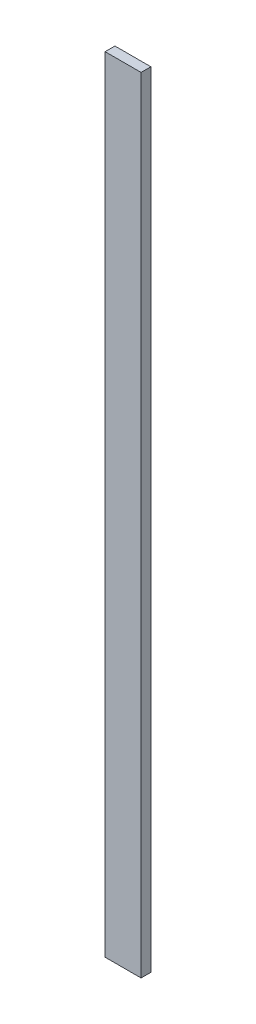
ISO-10303-21;
HEADER;
FILE_DESCRIPTION(('STEP AP214'),'2;1');
FILE_NAME('part.step','',(''),(''),'','','');
FILE_SCHEMA(('AUTOMOTIVE_DESIGN { 1 0 10303 214 1 1 1 1 }'));
ENDSEC;
DATA;
#1=APPLICATION_CONTEXT('core data for automotive mechanical design processes');
#2=APPLICATION_PROTOCOL_DEFINITION('international standard','automotive_design',2000,#1);
#3=PRODUCT_CONTEXT('',#1,'mechanical');
#4=PRODUCT('Part','Part','',(#3));
#5=PRODUCT_RELATED_PRODUCT_CATEGORY('part','',(#4));
#6=PRODUCT_DEFINITION_FORMATION('','',#4);
#7=PRODUCT_DEFINITION_CONTEXT('part definition',#1,'design');
#8=PRODUCT_DEFINITION('design','',#6,#7);
#9=PRODUCT_DEFINITION_SHAPE('','',#8);
#10=(LENGTH_UNIT() NAMED_UNIT(*) SI_UNIT(.MILLI.,.METRE.));
#11=(NAMED_UNIT(*) PLANE_ANGLE_UNIT() SI_UNIT($,.RADIAN.));
#12=(NAMED_UNIT(*) SI_UNIT($,.STERADIAN.) SOLID_ANGLE_UNIT());
#13=UNCERTAINTY_MEASURE_WITH_UNIT(LENGTH_MEASURE(1.E-05),#10,'distance_accuracy_value','');
#14=(GEOMETRIC_REPRESENTATION_CONTEXT(3) GLOBAL_UNCERTAINTY_ASSIGNED_CONTEXT((#13)) GLOBAL_UNIT_ASSIGNED_CONTEXT((#10,
#11,#12)) REPRESENTATION_CONTEXT('',''));
#15=CARTESIAN_POINT('',(0.,0.,0.));
#16=DIRECTION('',(0.,0.,1.));
#17=DIRECTION('',(1.,0.,0.));
#18=AXIS2_PLACEMENT_3D('',#15,#16,#17);
#19=CARTESIAN_POINT('',(-15.7044897978243,-51.4848222237951,38.1));
#20=DIRECTION('',(1.,0.,0.));
#21=DIRECTION('',(0.,0.,-1.));
#22=AXIS2_PLACEMENT_3D('',#19,#20,#21);
#23=PLANE('',#22);
#24=DIRECTION('',(0.,-1.,0.));
#25=VECTOR('',#24,1.);
#26=CARTESIAN_POINT('',(-15.7044897978243,-51.4848222237951,0.));
#27=LINE('',#26,#25);
#28=CARTESIAN_POINT('',(-15.7044897978243,2996.51517777621,0.));
#29=VERTEX_POINT('',#28);
#30=CARTESIAN_POINT('',(-15.7044897978243,-51.4848222237951,0.));
#31=VERTEX_POINT('',#30);
#32=EDGE_CURVE('E96',#29,#31,#27,.T.);
#33=ORIENTED_EDGE('',*,*,#32,.T.);
#34=DIRECTION('',(0.,0.,-1.));
#35=VECTOR('',#34,1.);
#36=CARTESIAN_POINT('',(-15.7044897978243,-51.4848222237951,38.1));
#37=LINE('',#36,#35);
#38=CARTESIAN_POINT('',(-15.7044897978243,-51.4848222237951,38.1));
#39=VERTEX_POINT('',#38);
#40=EDGE_CURVE('E11',#39,#31,#37,.T.);
#41=ORIENTED_EDGE('',*,*,#40,.F.);
#42=DIRECTION('',(0.,-1.,0.));
#43=VECTOR('',#42,1.);
#44=CARTESIAN_POINT('',(-15.7044897978243,-51.4848222237951,38.1));
#45=LINE('',#44,#43);
#46=CARTESIAN_POINT('',(-15.7044897978243,2996.51517777621,38.1));
#47=VERTEX_POINT('',#46);
#48=EDGE_CURVE('E84',#47,#39,#45,.T.);
#49=ORIENTED_EDGE('',*,*,#48,.F.);
#50=DIRECTION('',(0.,0.,-1.));
#51=VECTOR('',#50,1.);
#52=CARTESIAN_POINT('',(-15.7044897978243,2996.51517777621,38.1));
#53=LINE('',#52,#51);
#54=EDGE_CURVE('E92',#47,#29,#53,.T.);
#55=ORIENTED_EDGE('',*,*,#54,.T.);
#56=EDGE_LOOP('',(#33,#41,#49,#55));
#57=FACE_BOUND('',#56,.T.);
#58=ADVANCED_FACE('F33',(#57),#23,.F.);
#59=CARTESIAN_POINT('',(-15.7044897978243,-51.4848222237951,38.1));
#60=DIRECTION('',(0.,1.,0.));
#61=DIRECTION('',(0.,0.,1.));
#62=AXIS2_PLACEMENT_3D('',#59,#60,#61);
#63=PLANE('',#62);
#64=DIRECTION('',(1.,0.,0.));
#65=VECTOR('',#64,1.);
#66=CARTESIAN_POINT('',(-15.7044897978243,-51.4848222237951,0.));
#67=LINE('',#66,#65);
#68=CARTESIAN_POINT('',(123.995510202176,-51.4848222237951,0.));
#69=VERTEX_POINT('',#68);
#70=EDGE_CURVE('E88',#31,#69,#67,.T.);
#71=ORIENTED_EDGE('',*,*,#70,.T.);
#72=DIRECTION('',(0.,0.,-1.));
#73=VECTOR('',#72,1.);
#74=CARTESIAN_POINT('',(123.995510202176,-51.4848222237951,38.1));
#75=LINE('',#74,#73);
#76=CARTESIAN_POINT('',(123.995510202176,-51.4848222237951,38.1));
#77=VERTEX_POINT('',#76);
#78=EDGE_CURVE('E41',#77,#69,#75,.T.);
#79=ORIENTED_EDGE('',*,*,#78,.F.);
#80=DIRECTION('',(1.,0.,0.));
#81=VECTOR('',#80,1.);
#82=CARTESIAN_POINT('',(-15.7044897978243,-51.4848222237951,38.1));
#83=LINE('',#82,#81);
#84=EDGE_CURVE('E79',#39,#77,#83,.T.);
#85=ORIENTED_EDGE('',*,*,#84,.F.);
#86=ORIENTED_EDGE('',*,*,#40,.T.);
#87=EDGE_LOOP('',(#71,#79,#85,#86));
#88=FACE_BOUND('',#87,.T.);
#89=ADVANCED_FACE('F87',(#88),#63,.F.);
#90=CARTESIAN_POINT('',(123.995510202176,-51.4848222237951,38.1));
#91=DIRECTION('',(-1.,0.,0.));
#92=DIRECTION('',(0.,0.,1.));
#93=AXIS2_PLACEMENT_3D('',#90,#91,#92);
#94=PLANE('',#93);
#95=DIRECTION('',(0.,1.,0.));
#96=VECTOR('',#95,1.);
#97=CARTESIAN_POINT('',(123.995510202176,-51.4848222237951,0.));
#98=LINE('',#97,#96);
#99=CARTESIAN_POINT('',(123.995510202176,2996.51517777621,0.));
#100=VERTEX_POINT('',#99);
#101=EDGE_CURVE('E66',#69,#100,#98,.T.);
#102=ORIENTED_EDGE('',*,*,#101,.T.);
#103=DIRECTION('',(0.,0.,-1.));
#104=VECTOR('',#103,1.);
#105=CARTESIAN_POINT('',(123.995510202176,2996.51517777621,38.1));
#106=LINE('',#105,#104);
#107=CARTESIAN_POINT('',(123.995510202176,2996.51517777621,38.1));
#108=VERTEX_POINT('',#107);
#109=EDGE_CURVE('E89',#108,#100,#106,.T.);
#110=ORIENTED_EDGE('',*,*,#109,.F.);
#111=DIRECTION('',(0.,1.,0.));
#112=VECTOR('',#111,1.);
#113=CARTESIAN_POINT('',(123.995510202176,-51.4848222237951,38.1));
#114=LINE('',#113,#112);
#115=EDGE_CURVE('E82',#77,#108,#114,.T.);
#116=ORIENTED_EDGE('',*,*,#115,.F.);
#117=ORIENTED_EDGE('',*,*,#78,.T.);
#118=EDGE_LOOP('',(#102,#110,#116,#117));
#119=FACE_BOUND('',#118,.T.);
#120=ADVANCED_FACE('F90',(#119),#94,.F.);
#121=CARTESIAN_POINT('',(-15.7044897978243,2996.51517777621,38.1));
#122=DIRECTION('',(0.,-1.,0.));
#123=DIRECTION('',(0.,0.,-1.));
#124=AXIS2_PLACEMENT_3D('',#121,#122,#123);
#125=PLANE('',#124);
#126=DIRECTION('',(-1.,0.,0.));
#127=VECTOR('',#126,1.);
#128=CARTESIAN_POINT('',(-15.7044897978243,2996.51517777621,0.));
#129=LINE('',#128,#127);
#130=EDGE_CURVE('E72',#100,#29,#129,.T.);
#131=ORIENTED_EDGE('',*,*,#130,.T.);
#132=ORIENTED_EDGE('',*,*,#54,.F.);
#133=DIRECTION('',(-1.,0.,0.));
#134=VECTOR('',#133,1.);
#135=CARTESIAN_POINT('',(-15.7044897978243,2996.51517777621,38.1));
#136=LINE('',#135,#134);
#137=EDGE_CURVE('E49',#108,#47,#136,.T.);
#138=ORIENTED_EDGE('',*,*,#137,.F.);
#139=ORIENTED_EDGE('',*,*,#109,.T.);
#140=EDGE_LOOP('',(#131,#132,#138,#139));
#141=FACE_BOUND('',#140,.T.);
#142=ADVANCED_FACE('F103',(#141),#125,.F.);
#143=CARTESIAN_POINT('',(0.,0.,38.1));
#144=DIRECTION('',(0.,0.,-1.));
#145=DIRECTION('',(-1.,0.,0.));
#146=AXIS2_PLACEMENT_3D('',#143,#144,#145);
#147=PLANE('',#146);
#148=ORIENTED_EDGE('',*,*,#48,.T.);
#149=ORIENTED_EDGE('',*,*,#84,.T.);
#150=ORIENTED_EDGE('',*,*,#115,.T.);
#151=ORIENTED_EDGE('',*,*,#137,.T.);
#152=EDGE_LOOP('',(#148,#149,#150,#151));
#153=FACE_BOUND('',#152,.T.);
#154=ADVANCED_FACE('F80',(#153),#147,.F.);
#155=CARTESIAN_POINT('',(0.,0.,0.));
#156=DIRECTION('',(0.,0.,-1.));
#157=DIRECTION('',(-1.,0.,0.));
#158=AXIS2_PLACEMENT_3D('',#155,#156,#157);
#159=PLANE('',#158);
#160=ORIENTED_EDGE('',*,*,#32,.F.);
#161=ORIENTED_EDGE('',*,*,#130,.F.);
#162=ORIENTED_EDGE('',*,*,#101,.F.);
#163=ORIENTED_EDGE('',*,*,#70,.F.);
#164=EDGE_LOOP('',(#160,#161,#162,#163));
#165=FACE_BOUND('',#164,.T.);
#166=ADVANCED_FACE('F106',(#165),#159,.T.);
#167=CLOSED_SHELL('',(#58,#89,#120,#142,#154,#166));
#168=MANIFOLD_SOLID_BREP('B2',#167);
#169=ADVANCED_BREP_SHAPE_REPRESENTATION('',(#18,#168),#14);
#170=SHAPE_DEFINITION_REPRESENTATION(#9,#169);
ENDSEC;
END-ISO-10303-21;
